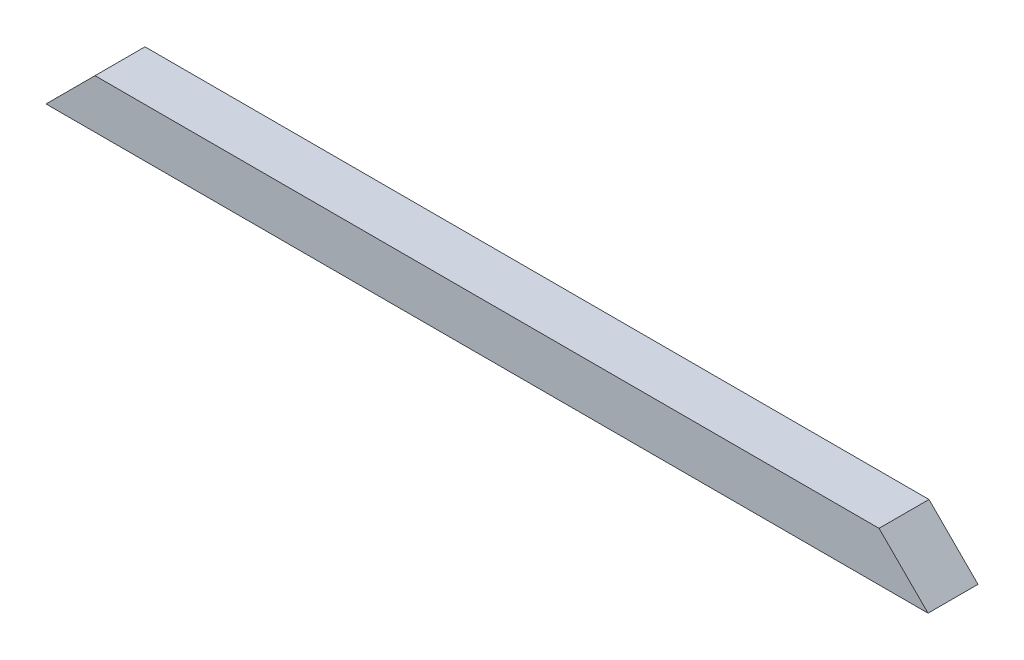
ISO-10303-21;
HEADER;
FILE_DESCRIPTION(('STEP AP214'),'2;1');
FILE_NAME('part.step','',(''),(''),'','','');
FILE_SCHEMA(('AUTOMOTIVE_DESIGN { 1 0 10303 214 1 1 1 1 }'));
ENDSEC;
DATA;
#1=APPLICATION_CONTEXT('core data for automotive mechanical design processes');
#2=APPLICATION_PROTOCOL_DEFINITION('international standard','automotive_design',2000,#1);
#3=PRODUCT_CONTEXT('',#1,'mechanical');
#4=PRODUCT('Part','Part','',(#3));
#5=PRODUCT_RELATED_PRODUCT_CATEGORY('part','',(#4));
#6=PRODUCT_DEFINITION_FORMATION('','',#4);
#7=PRODUCT_DEFINITION_CONTEXT('part definition',#1,'design');
#8=PRODUCT_DEFINITION('design','',#6,#7);
#9=PRODUCT_DEFINITION_SHAPE('','',#8);
#10=(LENGTH_UNIT() NAMED_UNIT(*) SI_UNIT(.MILLI.,.METRE.));
#11=(NAMED_UNIT(*) PLANE_ANGLE_UNIT() SI_UNIT($,.RADIAN.));
#12=(NAMED_UNIT(*) SI_UNIT($,.STERADIAN.) SOLID_ANGLE_UNIT());
#13=UNCERTAINTY_MEASURE_WITH_UNIT(LENGTH_MEASURE(1.E-05),#10,'distance_accuracy_value','');
#14=(GEOMETRIC_REPRESENTATION_CONTEXT(3) GLOBAL_UNCERTAINTY_ASSIGNED_CONTEXT((#13)) GLOBAL_UNIT_ASSIGNED_CONTEXT((#10,
#11,#12)) REPRESENTATION_CONTEXT('',''));
#15=CARTESIAN_POINT('',(0.,0.,0.));
#16=DIRECTION('',(0.,0.,1.));
#17=DIRECTION('',(1.,0.,0.));
#18=AXIS2_PLACEMENT_3D('',#15,#16,#17);
#19=CARTESIAN_POINT('',(457.2,25.4,-1.));
#20=DIRECTION('',(0.,1.,0.));
#21=DIRECTION('',(-1.,0.,0.));
#22=AXIS2_PLACEMENT_3D('',#19,#20,#21);
#23=PLANE('',#22);
#24=DIRECTION('',(0.,0.,0.999999999999998));
#25=VECTOR('',#24,1.);
#26=CARTESIAN_POINT('',(406.4,25.4,-1.));
#27=LINE('',#26,#25);
#28=CARTESIAN_POINT('',(406.4,25.4,-1.));
#29=VERTEX_POINT('',#28);
#30=CARTESIAN_POINT('',(406.4,25.4,50.8));
#31=VERTEX_POINT('',#30);
#32=EDGE_CURVE('E75',#29,#31,#27,.T.);
#33=ORIENTED_EDGE('',*,*,#32,.F.);
#34=DIRECTION('',(-1.,0.,0.));
#35=VECTOR('',#34,1.);
#36=CARTESIAN_POINT('',(457.2,25.4,-1.));
#37=LINE('',#36,#35);
#38=CARTESIAN_POINT('',(-406.400000000001,25.4,-1.));
#39=VERTEX_POINT('',#38);
#40=EDGE_CURVE('E84',#29,#39,#37,.T.);
#41=ORIENTED_EDGE('',*,*,#40,.T.);
#42=DIRECTION('',(0.,0.,0.999999999999998));
#43=VECTOR('',#42,1.);
#44=CARTESIAN_POINT('',(-406.400000000001,25.4,-1.));
#45=LINE('',#44,#43);
#46=CARTESIAN_POINT('',(-406.400000000001,25.4,50.8));
#47=VERTEX_POINT('',#46);
#48=EDGE_CURVE('E97',#39,#47,#45,.T.);
#49=ORIENTED_EDGE('',*,*,#48,.T.);
#50=DIRECTION('',(-1.,0.,0.));
#51=VECTOR('',#50,1.);
#52=CARTESIAN_POINT('',(457.2,25.4,50.8));
#53=LINE('',#52,#51);
#54=EDGE_CURVE('E85',#31,#47,#53,.T.);
#55=ORIENTED_EDGE('',*,*,#54,.F.);
#56=EDGE_LOOP('',(#33,#41,#49,#55));
#57=FACE_BOUND('',#56,.T.);
#58=ADVANCED_FACE('F33',(#57),#23,.T.);
#59=CARTESIAN_POINT('',(0.,0.,-1.));
#60=DIRECTION('',(0.,0.,0.999999999999998));
#61=DIRECTION('',(1.,0.,0.));
#62=AXIS2_PLACEMENT_3D('',#59,#60,#61);
#63=PLANE('',#62);
#64=ORIENTED_EDGE('',*,*,#40,.F.);
#65=DIRECTION('',(0.707106781186548,-0.707106781186549,0.));
#66=VECTOR('',#65,1.);
#67=CARTESIAN_POINT('',(215.9,215.9,-1.));
#68=LINE('',#67,#66);
#69=CARTESIAN_POINT('',(457.2,-25.3999999999999,-1.));
#70=VERTEX_POINT('',#69);
#71=EDGE_CURVE('E72',#29,#70,#68,.T.);
#72=ORIENTED_EDGE('',*,*,#71,.T.);
#73=DIRECTION('',(1.,0.,0.));
#74=VECTOR('',#73,1.);
#75=CARTESIAN_POINT('',(457.2,-25.3999999999999,-1.));
#76=LINE('',#75,#74);
#77=CARTESIAN_POINT('',(-457.200000000001,-25.4000000000001,-1.));
#78=VERTEX_POINT('',#77);
#79=EDGE_CURVE('E89',#78,#70,#76,.T.);
#80=ORIENTED_EDGE('',*,*,#79,.F.);
#81=DIRECTION('',(-0.707106781186548,-0.707106781186549,0.));
#82=VECTOR('',#81,1.);
#83=CARTESIAN_POINT('',(-215.900000000001,215.9,-1.));
#84=LINE('',#83,#82);
#85=EDGE_CURVE('E55',#39,#78,#84,.T.);
#86=ORIENTED_EDGE('',*,*,#85,.F.);
#87=EDGE_LOOP('',(#64,#72,#80,#86));
#88=FACE_BOUND('',#87,.T.);
#89=ADVANCED_FACE('F88',(#88),#63,.F.);
#90=CARTESIAN_POINT('',(0.,0.,50.8));
#91=DIRECTION('',(0.,0.,0.999999999999998));
#92=DIRECTION('',(1.,0.,0.));
#93=AXIS2_PLACEMENT_3D('',#90,#91,#92);
#94=PLANE('',#93);
#95=DIRECTION('',(0.707106781186548,-0.707106781186549,0.));
#96=VECTOR('',#95,1.);
#97=CARTESIAN_POINT('',(215.9,215.9,50.8));
#98=LINE('',#97,#96);
#99=CARTESIAN_POINT('',(457.2,-25.3999999999999,50.8));
#100=VERTEX_POINT('',#99);
#101=EDGE_CURVE('E48',#31,#100,#98,.T.);
#102=ORIENTED_EDGE('',*,*,#101,.F.);
#103=ORIENTED_EDGE('',*,*,#54,.T.);
#104=DIRECTION('',(-0.707106781186548,-0.707106781186549,0.));
#105=VECTOR('',#104,1.);
#106=CARTESIAN_POINT('',(-215.900000000001,215.9,50.8));
#107=LINE('',#106,#105);
#108=CARTESIAN_POINT('',(-457.200000000001,-25.4000000000001,50.8));
#109=VERTEX_POINT('',#108);
#110=EDGE_CURVE('E86',#47,#109,#107,.T.);
#111=ORIENTED_EDGE('',*,*,#110,.T.);
#112=DIRECTION('',(1.,0.,0.));
#113=VECTOR('',#112,1.);
#114=CARTESIAN_POINT('',(457.2,-25.3999999999999,50.8));
#115=LINE('',#114,#113);
#116=EDGE_CURVE('E94',#109,#100,#115,.T.);
#117=ORIENTED_EDGE('',*,*,#116,.T.);
#118=EDGE_LOOP('',(#102,#103,#111,#117));
#119=FACE_BOUND('',#118,.T.);
#120=ADVANCED_FACE('F105',(#119),#94,.T.);
#121=CARTESIAN_POINT('',(457.2,-25.3999999999999,-1.));
#122=DIRECTION('',(0.,-1.,0.));
#123=DIRECTION('',(1.,0.,0.));
#124=AXIS2_PLACEMENT_3D('',#121,#122,#123);
#125=PLANE('',#124);
#126=DIRECTION('',(0.,0.,0.999999999999998));
#127=VECTOR('',#126,1.);
#128=CARTESIAN_POINT('',(457.2,-25.3999999999999,-1.));
#129=LINE('',#128,#127);
#130=EDGE_CURVE('E11',#70,#100,#129,.T.);
#131=ORIENTED_EDGE('',*,*,#130,.T.);
#132=ORIENTED_EDGE('',*,*,#116,.F.);
#133=DIRECTION('',(0.,0.,0.999999999999998));
#134=VECTOR('',#133,1.);
#135=CARTESIAN_POINT('',(-457.200000000001,-25.4000000000001,-1.));
#136=LINE('',#135,#134);
#137=EDGE_CURVE('E37',#78,#109,#136,.T.);
#138=ORIENTED_EDGE('',*,*,#137,.F.);
#139=ORIENTED_EDGE('',*,*,#79,.T.);
#140=EDGE_LOOP('',(#131,#132,#138,#139));
#141=FACE_BOUND('',#140,.T.);
#142=ADVANCED_FACE('F35',(#141),#125,.T.);
#143=CARTESIAN_POINT('',(-215.900000000001,215.9,-1.));
#144=DIRECTION('',(-0.707106781186549,0.707106781186548,0.));
#145=DIRECTION('',(-0.707106781186548,-0.707106781186549,0.));
#146=AXIS2_PLACEMENT_3D('',#143,#144,#145);
#147=PLANE('',#146);
#148=ORIENTED_EDGE('',*,*,#110,.F.);
#149=ORIENTED_EDGE('',*,*,#48,.F.);
#150=ORIENTED_EDGE('',*,*,#85,.T.);
#151=ORIENTED_EDGE('',*,*,#137,.T.);
#152=EDGE_LOOP('',(#148,#149,#150,#151));
#153=FACE_BOUND('',#152,.T.);
#154=ADVANCED_FACE('F107',(#153),#147,.T.);
#155=CARTESIAN_POINT('',(215.9,215.9,-1.));
#156=DIRECTION('',(-0.707106781186549,-0.707106781186548,0.));
#157=DIRECTION('',(0.707106781186548,-0.707106781186549,0.));
#158=AXIS2_PLACEMENT_3D('',#155,#156,#157);
#159=PLANE('',#158);
#160=ORIENTED_EDGE('',*,*,#101,.T.);
#161=ORIENTED_EDGE('',*,*,#130,.F.);
#162=ORIENTED_EDGE('',*,*,#71,.F.);
#163=ORIENTED_EDGE('',*,*,#32,.T.);
#164=EDGE_LOOP('',(#160,#161,#162,#163));
#165=FACE_BOUND('',#164,.T.);
#166=ADVANCED_FACE('F74',(#165),#159,.F.);
#167=CLOSED_SHELL('',(#58,#89,#120,#142,#154,#166));
#168=MANIFOLD_SOLID_BREP('B2',#167);
#169=ADVANCED_BREP_SHAPE_REPRESENTATION('',(#18,#168),#14);
#170=SHAPE_DEFINITION_REPRESENTATION(#9,#169);
ENDSEC;
END-ISO-10303-21;
